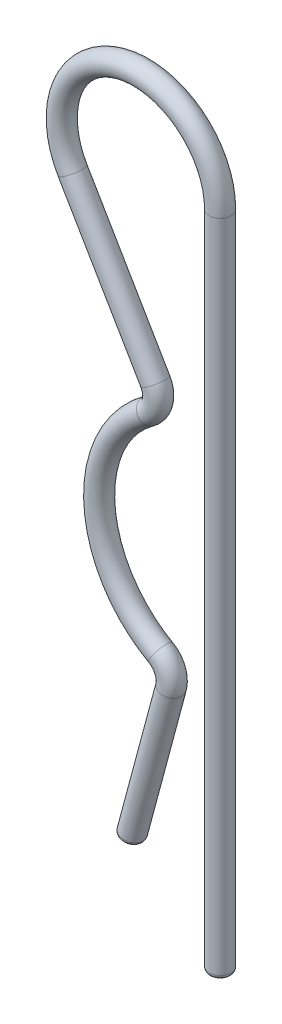
ISO-10303-21;
HEADER;
FILE_DESCRIPTION(('STEP AP214'),'2;1');
FILE_NAME('part.step','',(''),(''),'','','');
FILE_SCHEMA(('AUTOMOTIVE_DESIGN { 1 0 10303 214 1 1 1 1 }'));
ENDSEC;
DATA;
#1=APPLICATION_CONTEXT('core data for automotive mechanical design processes');
#2=APPLICATION_PROTOCOL_DEFINITION('international standard','automotive_design',2000,#1);
#3=PRODUCT_CONTEXT('',#1,'mechanical');
#4=PRODUCT('Part','Part','',(#3));
#5=PRODUCT_RELATED_PRODUCT_CATEGORY('part','',(#4));
#6=PRODUCT_DEFINITION_FORMATION('','',#4);
#7=PRODUCT_DEFINITION_CONTEXT('part definition',#1,'design');
#8=PRODUCT_DEFINITION('design','',#6,#7);
#9=PRODUCT_DEFINITION_SHAPE('','',#8);
#10=(LENGTH_UNIT() NAMED_UNIT(*) SI_UNIT(.MILLI.,.METRE.));
#11=(NAMED_UNIT(*) PLANE_ANGLE_UNIT() SI_UNIT($,.RADIAN.));
#12=(NAMED_UNIT(*) SI_UNIT($,.STERADIAN.) SOLID_ANGLE_UNIT());
#13=UNCERTAINTY_MEASURE_WITH_UNIT(LENGTH_MEASURE(1.E-05),#10,'distance_accuracy_value','');
#14=(GEOMETRIC_REPRESENTATION_CONTEXT(3) GLOBAL_UNCERTAINTY_ASSIGNED_CONTEXT((#13)) GLOBAL_UNIT_ASSIGNED_CONTEXT((#10,
#11,#12)) REPRESENTATION_CONTEXT('',''));
#15=CARTESIAN_POINT('',(0.,0.,0.));
#16=DIRECTION('',(0.,0.,1.));
#17=DIRECTION('',(1.,0.,0.));
#18=AXIS2_PLACEMENT_3D('',#15,#16,#17);
#19=CARTESIAN_POINT('',(0.,-80.,0.));
#20=DIRECTION('',(0.,1.,0.));
#21=DIRECTION('',(0.,0.,1.));
#22=AXIS2_PLACEMENT_3D('',#19,#20,#21);
#23=PLANE('',#22);
#24=CARTESIAN_POINT('',(0.,-80.,0.));
#25=DIRECTION('',(0.,1.,0.));
#26=DIRECTION('',(0.,0.,1.));
#27=AXIS2_PLACEMENT_3D('',#24,#25,#26);
#28=CIRCLE('',#27,1.5);
#29=CARTESIAN_POINT('',(0.,-80.,1.5));
#30=VERTEX_POINT('',#29);
#31=EDGE_CURVE('E43',#30,#30,#28,.F.);
#32=ORIENTED_EDGE('',*,*,#31,.T.);
#33=EDGE_LOOP('',(#32));
#34=FACE_BOUND('',#33,.T.);
#35=ADVANCED_FACE('F32',(#34),#23,.F.);
#36=CARTESIAN_POINT('',(-20.2203058573454,-63.3951262484398,0.));
#37=DIRECTION('',(-0.258819045102514,-0.96592582628907,0.));
#38=DIRECTION('',(0.,0.,1.));
#39=AXIS2_PLACEMENT_3D('',#36,#37,#38);
#40=PLANE('',#39);
#41=CARTESIAN_POINT('',(-20.2203058573454,-63.3951262484398,0.));
#42=DIRECTION('',(-0.258819045102514,-0.96592582628907,0.));
#43=DIRECTION('',(0.96592582628907,-0.258819045102514,0.));
#44=AXIS2_PLACEMENT_3D('',#41,#42,#43);
#45=CIRCLE('',#44,1.5);
#46=CARTESIAN_POINT('',(-18.7714171179118,-63.7833548160936,0.));
#47=VERTEX_POINT('',#46);
#48=EDGE_CURVE('E39',#47,#47,#45,.T.);
#49=ORIENTED_EDGE('',*,*,#48,.T.);
#50=EDGE_LOOP('',(#49));
#51=FACE_BOUND('',#50,.T.);
#52=ADVANCED_FACE('F75',(#51),#40,.T.);
#53=CARTESIAN_POINT('',(0.,-80.,0.));
#54=DIRECTION('',(0.,1.,0.));
#55=DIRECTION('',(0.,0.,1.));
#56=AXIS2_PLACEMENT_3D('',#53,#54,#55);
#57=CYLINDRICAL_SURFACE('',#56,2.5);
#58=CARTESIAN_POINT('',(0.,-79.,0.));
#59=DIRECTION('',(0.,1.,0.));
#60=DIRECTION('',(0.,0.,1.));
#61=AXIS2_PLACEMENT_3D('',#58,#59,#60);
#62=CIRCLE('',#61,2.5);
#63=CARTESIAN_POINT('',(0.,-79.,2.5));
#64=VERTEX_POINT('',#63);
#65=EDGE_CURVE('E47',#64,#64,#62,.T.);
#66=ORIENTED_EDGE('',*,*,#65,.T.);
#67=EDGE_LOOP('',(#66));
#68=FACE_BOUND('',#67,.T.);
#69=CARTESIAN_POINT('',(0.,70.,0.));
#70=DIRECTION('',(0.,1.,0.));
#71=DIRECTION('',(0.,0.,1.));
#72=AXIS2_PLACEMENT_3D('',#69,#70,#71);
#73=CIRCLE('',#72,2.5);
#74=CARTESIAN_POINT('',(2.5,70.,0.));
#75=VERTEX_POINT('',#74);
#76=EDGE_CURVE('E67',#75,#75,#73,.T.);
#77=ORIENTED_EDGE('',*,*,#76,.F.);
#78=EDGE_LOOP('',(#77));
#79=FACE_BOUND('',#78,.T.);
#80=ADVANCED_FACE('F73',(#68,#79),#57,.T.);
#81=CARTESIAN_POINT('',(-18.,70.,0.));
#82=DIRECTION('',(0.,0.,1.));
#83=DIRECTION('',(1.,0.,0.));
#84=AXIS2_PLACEMENT_3D('',#81,#82,#83);
#85=TOROIDAL_SURFACE('',#84,18.,2.5);
#86=CARTESIAN_POINT('',(-33.5328816054567,60.9044192581857,0.));
#87=DIRECTION('',(0.505310041211906,-0.862937866969819,0.));
#88=DIRECTION('',(0.,0.,1.));
#89=AXIS2_PLACEMENT_3D('',#86,#87,#88);
#90=CIRCLE('',#89,2.5);
#91=CARTESIAN_POINT('',(-35.6902262728813,59.6411441551559,0.));
#92=VERTEX_POINT('',#91);
#93=EDGE_CURVE('E64',#92,#92,#90,.T.);
#94=CARTESIAN_POINT('',(-18.,70.,0.));
#95=DIRECTION('',(0.,0.,1.));
#96=DIRECTION('',(1.,0.,0.));
#97=AXIS2_PLACEMENT_3D('',#94,#95,#96);
#98=CIRCLE('',#97,20.5);
#99=EDGE_CURVE('',#75,#92,#98,.T.);
#100=ORIENTED_EDGE('',*,*,#76,.T.);
#101=ORIENTED_EDGE('',*,*,#93,.F.);
#102=ORIENTED_EDGE('',*,*,#99,.T.);
#103=ORIENTED_EDGE('',*,*,#99,.F.);
#104=EDGE_LOOP('',(#100,#102,#101,#103));
#105=FACE_BOUND('',#104,.T.);
#106=ADVANCED_FACE('F71',(#105),#85,.T.);
#107=CARTESIAN_POINT('',(-33.5328816054567,60.9044192581857,0.));
#108=DIRECTION('',(0.505310041211907,-0.862937866969819,0.));
#109=DIRECTION('',(0.862937866969819,0.505310041211907,0.));
#110=AXIS2_PLACEMENT_3D('',#107,#108,#109);
#111=CYLINDRICAL_SURFACE('',#110,2.5);
#112=CARTESIAN_POINT('',(-14.7579172240191,28.8416728364145,0.));
#113=DIRECTION('',(0.505310041211907,-0.862937866969819,0.));
#114=DIRECTION('',(0.,0.,1.));
#115=AXIS2_PLACEMENT_3D('',#112,#113,#114);
#116=CIRCLE('',#115,2.5);
#117=CARTESIAN_POINT('',(-12.6005725565945,30.1049479394442,0.));
#118=VERTEX_POINT('',#117);
#119=EDGE_CURVE('E61',#118,#118,#116,.T.);
#120=ORIENTED_EDGE('',*,*,#119,.F.);
#121=EDGE_LOOP('',(#120));
#122=FACE_BOUND('',#121,.T.);
#123=ORIENTED_EDGE('',*,*,#93,.T.);
#124=EDGE_LOOP('',(#123));
#125=FACE_BOUND('',#124,.T.);
#126=ADVANCED_FACE('F82',(#122,#125),#111,.T.);
#127=CARTESIAN_POINT('',(-19.0726065588682,26.3151226303549,0.));
#128=DIRECTION('',(0.,0.,-1.));
#129=DIRECTION('',(-1.,0.,0.));
#130=AXIS2_PLACEMENT_3D('',#127,#128,#129);
#131=TOROIDAL_SURFACE('',#130,5.,2.5);
#132=CARTESIAN_POINT('',(-16.1383593959654,22.2666422256849,0.));
#133=DIRECTION('',(-0.809696080933999,-0.586849432580559,0.));
#134=DIRECTION('',(0.,0.,1.));
#135=AXIS2_PLACEMENT_3D('',#132,#133,#134);
#136=CIRCLE('',#135,2.5);
#137=CARTESIAN_POINT('',(-14.671235814514,20.2424020233499,0.));
#138=VERTEX_POINT('',#137);
#139=EDGE_CURVE('E58',#138,#138,#136,.T.);
#140=CARTESIAN_POINT('',(-19.0726065588682,26.3151226303549,0.));
#141=DIRECTION('',(0.,0.,-1.));
#142=DIRECTION('',(-1.,0.,0.));
#143=AXIS2_PLACEMENT_3D('',#140,#141,#142);
#144=CIRCLE('',#143,7.5);
#145=EDGE_CURVE('',#118,#138,#144,.T.);
#146=ORIENTED_EDGE('',*,*,#119,.T.);
#147=ORIENTED_EDGE('',*,*,#139,.F.);
#148=ORIENTED_EDGE('',*,*,#145,.T.);
#149=ORIENTED_EDGE('',*,*,#145,.F.);
#150=EDGE_LOOP('',(#146,#148,#147,#149));
#151=FACE_BOUND('',#150,.T.);
#152=ADVANCED_FACE('F152',(#151),#131,.T.);
#153=CARTESIAN_POINT('',(0.,0.,0.));
#154=DIRECTION('',(0.,0.,1.));
#155=DIRECTION('',(1.,0.,0.));
#156=AXIS2_PLACEMENT_3D('',#153,#154,#155);
#157=TOROIDAL_SURFACE('',#156,27.5,2.5);
#158=CARTESIAN_POINT('',(-13.5310732701716,-23.9407613946852,0.));
#159=DIRECTION('',(0.870573141624916,-0.492039028006239,0.));
#160=DIRECTION('',(0.,0.,1.));
#161=AXIS2_PLACEMENT_3D('',#158,#159,#160);
#162=CIRCLE('',#161,2.5);
#163=CARTESIAN_POINT('',(-12.300975700156,-21.7643285406229,0.));
#164=VERTEX_POINT('',#163);
#165=EDGE_CURVE('E55',#164,#164,#162,.T.);
#166=ORIENTED_EDGE('',*,*,#165,.F.);
#167=EDGE_LOOP('',(#166));
#168=FACE_BOUND('',#167,.T.);
#169=ORIENTED_EDGE('',*,*,#139,.T.);
#170=EDGE_LOOP('',(#169));
#171=FACE_BOUND('',#170,.T.);
#172=ADVANCED_FACE('F96',(#168,#171),#157,.T.);
#173=CARTESIAN_POINT('',(-15.9912684102027,-28.2936271028098,0.));
#174=DIRECTION('',(0.,0.,-1.));
#175=DIRECTION('',(-1.,0.,0.));
#176=AXIS2_PLACEMENT_3D('',#173,#174,#175);
#177=TOROIDAL_SURFACE('',#176,5.00000000000001,2.5);
#178=CARTESIAN_POINT('',(-11.1616392787574,-29.5877223283224,0.));
#179=DIRECTION('',(-0.258819045102514,-0.96592582628907,0.));
#180=DIRECTION('',(0.,0.,1.));
#181=AXIS2_PLACEMENT_3D('',#178,#179,#180);
#182=CIRCLE('',#181,2.5);
#183=CARTESIAN_POINT('',(-8.74682471303471,-30.2347699410786,0.));
#184=VERTEX_POINT('',#183);
#185=EDGE_CURVE('E52',#184,#184,#182,.T.);
#186=CARTESIAN_POINT('',(-15.9912684102027,-28.2936271028098,0.));
#187=DIRECTION('',(0.,0.,-1.));
#188=DIRECTION('',(-1.,0.,0.));
#189=AXIS2_PLACEMENT_3D('',#186,#187,#188);
#190=CIRCLE('',#189,7.50000000000001);
#191=EDGE_CURVE('',#164,#184,#190,.T.);
#192=ORIENTED_EDGE('',*,*,#165,.T.);
#193=ORIENTED_EDGE('',*,*,#185,.F.);
#194=ORIENTED_EDGE('',*,*,#191,.T.);
#195=ORIENTED_EDGE('',*,*,#191,.F.);
#196=EDGE_LOOP('',(#192,#194,#193,#195));
#197=FACE_BOUND('',#196,.T.);
#198=ADVANCED_FACE('F89',(#197),#177,.T.);
#199=CARTESIAN_POINT('',(-11.1616392787574,-29.5877223283224,0.));
#200=DIRECTION('',(-0.258819045102514,-0.96592582628907,0.));
#201=DIRECTION('',(0.96592582628907,-0.258819045102514,0.));
#202=AXIS2_PLACEMENT_3D('',#199,#200,#201);
#203=CYLINDRICAL_SURFACE('',#202,2.5);
#204=CARTESIAN_POINT('',(-19.9614868122429,-62.4292004221507,0.));
#205=DIRECTION('',(-0.258819045102514,-0.96592582628907,0.));
#206=DIRECTION('',(0.96592582628907,-0.258819045102514,0.));
#207=AXIS2_PLACEMENT_3D('',#204,#205,#206);
#208=CIRCLE('',#207,2.5);
#209=CARTESIAN_POINT('',(-17.5466722465202,-63.076248034907,0.));
#210=VERTEX_POINT('',#209);
#211=EDGE_CURVE('E10',#210,#210,#208,.F.);
#212=ORIENTED_EDGE('',*,*,#211,.T.);
#213=EDGE_LOOP('',(#212));
#214=FACE_BOUND('',#213,.T.);
#215=ORIENTED_EDGE('',*,*,#185,.T.);
#216=EDGE_LOOP('',(#215));
#217=FACE_BOUND('',#216,.T.);
#218=ADVANCED_FACE('F86',(#214,#217),#203,.T.);
#219=CARTESIAN_POINT('',(0.,-79.,0.));
#220=DIRECTION('',(0.,1.,0.));
#221=DIRECTION('',(0.,0.,1.));
#222=AXIS2_PLACEMENT_3D('',#219,#220,#221);
#223=TOROIDAL_SURFACE('',#222,1.5,1.);
#224=ORIENTED_EDGE('',*,*,#31,.F.);
#225=EDGE_LOOP('',(#224));
#226=FACE_BOUND('',#225,.T.);
#227=ORIENTED_EDGE('',*,*,#65,.F.);
#228=EDGE_LOOP('',(#227));
#229=FACE_BOUND('',#228,.T.);
#230=ADVANCED_FACE('F88',(#226,#229),#223,.T.);
#231=CARTESIAN_POINT('',(-19.9614868122429,-62.4292004221507,0.));
#232=DIRECTION('',(-0.258819045102514,-0.96592582628907,0.));
#233=DIRECTION('',(0.96592582628907,-0.258819045102514,0.));
#234=AXIS2_PLACEMENT_3D('',#231,#232,#233);
#235=TOROIDAL_SURFACE('',#234,1.5,1.);
#236=ORIENTED_EDGE('',*,*,#211,.F.);
#237=EDGE_LOOP('',(#236));
#238=FACE_BOUND('',#237,.T.);
#239=ORIENTED_EDGE('',*,*,#48,.F.);
#240=EDGE_LOOP('',(#239));
#241=FACE_BOUND('',#240,.T.);
#242=ADVANCED_FACE('F34',(#238,#241),#235,.T.);
#243=CLOSED_SHELL('',(#35,#52,#80,#106,#126,#152,#172,#198,#218,#230,#242));
#244=MANIFOLD_SOLID_BREP('B2',#243);
#245=ADVANCED_BREP_SHAPE_REPRESENTATION('',(#18,#244),#14);
#246=SHAPE_DEFINITION_REPRESENTATION(#9,#245);
ENDSEC;
END-ISO-10303-21;
